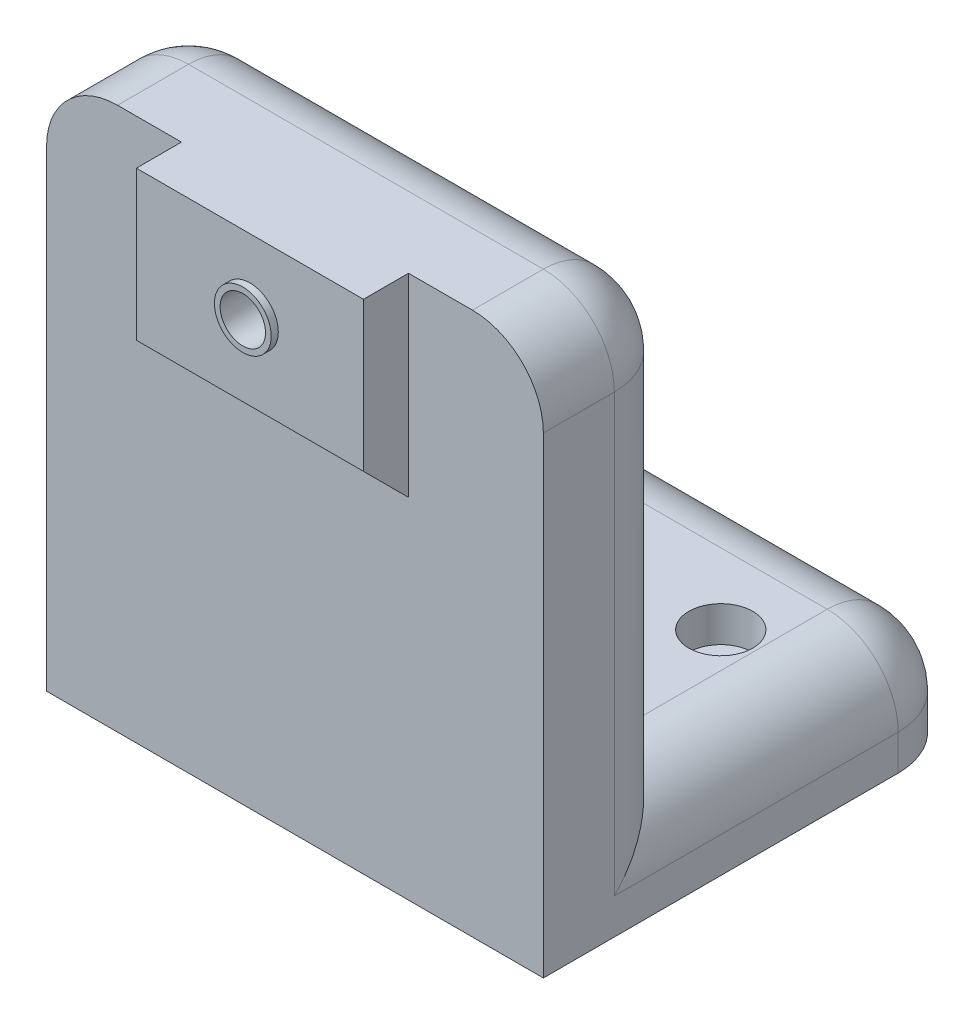
ISO-10303-21;
HEADER;
FILE_DESCRIPTION(('STEP AP214'),'2;1');
FILE_NAME('part.step','',(''),(''),'','','');
FILE_SCHEMA(('AUTOMOTIVE_DESIGN { 1 0 10303 214 1 1 1 1 }'));
ENDSEC;
DATA;
#1=APPLICATION_CONTEXT('core data for automotive mechanical design processes');
#2=APPLICATION_PROTOCOL_DEFINITION('international standard','automotive_design',2000,#1);
#3=PRODUCT_CONTEXT('',#1,'mechanical');
#4=PRODUCT('Part','Part','',(#3));
#5=PRODUCT_RELATED_PRODUCT_CATEGORY('part','',(#4));
#6=PRODUCT_DEFINITION_FORMATION('','',#4);
#7=PRODUCT_DEFINITION_CONTEXT('part definition',#1,'design');
#8=PRODUCT_DEFINITION('design','',#6,#7);
#9=PRODUCT_DEFINITION_SHAPE('','',#8);
#10=(LENGTH_UNIT() NAMED_UNIT(*) SI_UNIT(.MILLI.,.METRE.));
#11=(NAMED_UNIT(*) PLANE_ANGLE_UNIT() SI_UNIT($,.RADIAN.));
#12=(NAMED_UNIT(*) SI_UNIT($,.STERADIAN.) SOLID_ANGLE_UNIT());
#13=UNCERTAINTY_MEASURE_WITH_UNIT(LENGTH_MEASURE(1.E-05),#10,'distance_accuracy_value','');
#14=(GEOMETRIC_REPRESENTATION_CONTEXT(3) GLOBAL_UNCERTAINTY_ASSIGNED_CONTEXT((#13)) GLOBAL_UNIT_ASSIGNED_CONTEXT((#10,
#11,#12)) REPRESENTATION_CONTEXT('',''));
#15=CARTESIAN_POINT('',(0.,0.,0.));
#16=DIRECTION('',(0.,0.,1.));
#17=DIRECTION('',(1.,0.,0.));
#18=AXIS2_PLACEMENT_3D('',#15,#16,#17);
#19=CARTESIAN_POINT('',(0.,0.,6.35));
#20=DIRECTION('',(0.,0.,1.));
#21=DIRECTION('',(1.,0.,0.));
#22=AXIS2_PLACEMENT_3D('',#19,#20,#21);
#23=PLANE('',#22);
#24=DIRECTION('',(0.,1.,0.));
#25=VECTOR('',#24,1.);
#26=CARTESIAN_POINT('',(51.,76.5,6.35));
#27=LINE('',#26,#25);
#28=CARTESIAN_POINT('',(51.,55.4999999999999,6.35));
#29=VERTEX_POINT('',#28);
#30=CARTESIAN_POINT('',(51.,76.5,6.35));
#31=VERTEX_POINT('',#30);
#32=EDGE_CURVE('E73',#29,#31,#27,.T.);
#33=ORIENTED_EDGE('',*,*,#32,.T.);
#34=DIRECTION('',(-1.,0.,0.));
#35=VECTOR('',#34,1.);
#36=CARTESIAN_POINT('',(19.,76.5,6.35));
#37=LINE('',#36,#35);
#38=CARTESIAN_POINT('',(19.,76.5,6.35));
#39=VERTEX_POINT('',#38);
#40=EDGE_CURVE('E171',#31,#39,#37,.T.);
#41=ORIENTED_EDGE('',*,*,#40,.T.);
#42=DIRECTION('',(0.,-1.,0.));
#43=VECTOR('',#42,1.);
#44=CARTESIAN_POINT('',(19.,76.5,6.35));
#45=LINE('',#44,#43);
#46=CARTESIAN_POINT('',(19.,55.4999999999999,6.35));
#47=VERTEX_POINT('',#46);
#48=EDGE_CURVE('E66',#39,#47,#45,.T.);
#49=ORIENTED_EDGE('',*,*,#48,.T.);
#50=DIRECTION('',(-1.,0.,0.));
#51=VECTOR('',#50,1.);
#52=CARTESIAN_POINT('',(19.,55.4999999999999,6.35));
#53=LINE('',#52,#51);
#54=EDGE_CURVE('E182',#47,#29,#53,.F.);
#55=ORIENTED_EDGE('',*,*,#54,.T.);
#56=EDGE_LOOP('',(#33,#41,#49,#55));
#57=FACE_BOUND('',#56,.T.);
#58=CARTESIAN_POINT('',(35.,66.5,6.35));
#59=DIRECTION('',(0.,0.,1.));
#60=DIRECTION('',(1.,0.,0.));
#61=AXIS2_PLACEMENT_3D('',#58,#59,#60);
#62=CIRCLE('',#61,4.00000000000001);
#63=CARTESIAN_POINT('',(39.,66.5,6.35));
#64=VERTEX_POINT('',#63);
#65=EDGE_CURVE('E425',#64,#64,#62,.T.);
#66=ORIENTED_EDGE('',*,*,#65,.F.);
#67=EDGE_LOOP('',(#66));
#68=FACE_BOUND('',#67,.T.);
#69=ADVANCED_FACE('F49',(#57,#68),#23,.T.);
#70=CARTESIAN_POINT('',(0.,15.,0.));
#71=DIRECTION('',(0.,0.,-1.));
#72=DIRECTION('',(-1.,0.,0.));
#73=AXIS2_PLACEMENT_3D('',#70,#71,#72);
#74=PLANE('',#73);
#75=DIRECTION('',(0.,1.,0.));
#76=VECTOR('',#75,1.);
#77=CARTESIAN_POINT('',(51.,76.5,0.));
#78=LINE('',#77,#76);
#79=CARTESIAN_POINT('',(51.,49.1499999999999,0.));
#80=VERTEX_POINT('',#79);
#81=CARTESIAN_POINT('',(51.,76.5,0.));
#82=VERTEX_POINT('',#81);
#83=EDGE_CURVE('E188',#80,#82,#78,.T.);
#84=ORIENTED_EDGE('',*,*,#83,.F.);
#85=DIRECTION('',(-1.,0.,0.));
#86=VECTOR('',#85,1.);
#87=CARTESIAN_POINT('',(19.,49.1499999999999,0.));
#88=LINE('',#87,#86);
#89=CARTESIAN_POINT('',(19.,49.1499999999999,0.));
#90=VERTEX_POINT('',#89);
#91=EDGE_CURVE('E357',#80,#90,#88,.T.);
#92=ORIENTED_EDGE('',*,*,#91,.T.);
#93=DIRECTION('',(0.,-1.,0.));
#94=VECTOR('',#93,1.);
#95=CARTESIAN_POINT('',(19.,76.5,0.));
#96=LINE('',#95,#94);
#97=CARTESIAN_POINT('',(19.,76.5,0.));
#98=VERTEX_POINT('',#97);
#99=EDGE_CURVE('E185',#98,#90,#96,.T.);
#100=ORIENTED_EDGE('',*,*,#99,.F.);
#101=DIRECTION('',(1.,0.,0.));
#102=VECTOR('',#101,1.);
#103=CARTESIAN_POINT('',(0.,76.5,0.));
#104=LINE('',#103,#102);
#105=CARTESIAN_POINT('',(10.,76.5,0.));
#106=VERTEX_POINT('',#105);
#107=EDGE_CURVE('E244',#106,#98,#104,.T.);
#108=ORIENTED_EDGE('',*,*,#107,.F.);
#109=CARTESIAN_POINT('',(10.,66.5,0.));
#110=DIRECTION('',(0.,0.,-1.));
#111=DIRECTION('',(-1.,0.,0.));
#112=AXIS2_PLACEMENT_3D('',#109,#110,#111);
#113=CIRCLE('',#112,10.);
#114=CARTESIAN_POINT('',(0.,66.5,0.));
#115=VERTEX_POINT('',#114);
#116=EDGE_CURVE('E355',#106,#115,#113,.F.);
#117=ORIENTED_EDGE('',*,*,#116,.T.);
#118=DIRECTION('',(0.,-1.,0.));
#119=VECTOR('',#118,1.);
#120=CARTESIAN_POINT('',(0.,15.,0.));
#121=LINE('',#120,#119);
#122=CARTESIAN_POINT('',(0.,0.,0.));
#123=VERTEX_POINT('',#122);
#124=EDGE_CURVE('E270',#115,#123,#121,.T.);
#125=ORIENTED_EDGE('',*,*,#124,.T.);
#126=DIRECTION('',(1.,0.,0.));
#127=VECTOR('',#126,1.);
#128=CARTESIAN_POINT('',(0.,0.,0.));
#129=LINE('',#128,#127);
#130=CARTESIAN_POINT('',(70.,0.,0.));
#131=VERTEX_POINT('',#130);
#132=EDGE_CURVE('E255',#123,#131,#129,.T.);
#133=ORIENTED_EDGE('',*,*,#132,.T.);
#134=DIRECTION('',(0.,-1.,0.));
#135=VECTOR('',#134,1.);
#136=CARTESIAN_POINT('',(70.,15.,0.));
#137=LINE('',#136,#135);
#138=CARTESIAN_POINT('',(70.,66.5,0.));
#139=VERTEX_POINT('',#138);
#140=EDGE_CURVE('E267',#139,#131,#137,.T.);
#141=ORIENTED_EDGE('',*,*,#140,.F.);
#142=CARTESIAN_POINT('',(60.,66.5,0.));
#143=DIRECTION('',(0.,0.,-1.));
#144=DIRECTION('',(-1.,0.,0.));
#145=AXIS2_PLACEMENT_3D('',#142,#143,#144);
#146=CIRCLE('',#145,10.);
#147=CARTESIAN_POINT('',(60.,76.5,0.));
#148=VERTEX_POINT('',#147);
#149=EDGE_CURVE('E351',#139,#148,#146,.F.);
#150=ORIENTED_EDGE('',*,*,#149,.T.);
#151=EDGE_CURVE('E248',#82,#148,#104,.T.);
#152=ORIENTED_EDGE('',*,*,#151,.F.);
#153=EDGE_LOOP('',(#84,#92,#100,#108,#117,#125,#133,#141,#150,#152));
#154=FACE_BOUND('',#153,.T.);
#155=ADVANCED_FACE('F417',(#154),#74,.F.);
#156=CARTESIAN_POINT('',(55.,0.,-40.));
#157=DIRECTION('',(0.,1.,0.));
#158=DIRECTION('',(0.,0.,1.));
#159=AXIS2_PLACEMENT_3D('',#156,#157,#158);
#160=CYLINDRICAL_SURFACE('',#159,1.9);
#161=CARTESIAN_POINT('',(55.,0.,-40.));
#162=DIRECTION('',(0.,1.,0.));
#163=DIRECTION('',(0.,0.,1.));
#164=AXIS2_PLACEMENT_3D('',#161,#162,#163);
#165=CIRCLE('',#164,1.9);
#166=CARTESIAN_POINT('',(55.,0.,-38.1));
#167=VERTEX_POINT('',#166);
#168=EDGE_CURVE('E235',#167,#167,#165,.T.);
#169=ORIENTED_EDGE('',*,*,#168,.F.);
#170=EDGE_LOOP('',(#169));
#171=FACE_BOUND('',#170,.T.);
#172=CARTESIAN_POINT('',(55.,10.,-40.));
#173=DIRECTION('',(0.,1.,0.));
#174=DIRECTION('',(0.,0.,1.));
#175=AXIS2_PLACEMENT_3D('',#172,#173,#174);
#176=CIRCLE('',#175,1.9);
#177=CARTESIAN_POINT('',(55.,10.,-38.1));
#178=VERTEX_POINT('',#177);
#179=EDGE_CURVE('E239',#178,#178,#176,.F.);
#180=ORIENTED_EDGE('',*,*,#179,.F.);
#181=EDGE_LOOP('',(#180));
#182=FACE_BOUND('',#181,.T.);
#183=ADVANCED_FACE('F458',(#171,#182),#160,.F.);
#184=CARTESIAN_POINT('',(35.,0.,-40.));
#185=DIRECTION('',(0.,1.,0.));
#186=DIRECTION('',(0.,0.,1.));
#187=AXIS2_PLACEMENT_3D('',#184,#185,#186);
#188=CYLINDRICAL_SURFACE('',#187,1.9);
#189=CARTESIAN_POINT('',(35.,0.,-40.));
#190=DIRECTION('',(0.,1.,0.));
#191=DIRECTION('',(0.,0.,1.));
#192=AXIS2_PLACEMENT_3D('',#189,#190,#191);
#193=CIRCLE('',#192,1.9);
#194=CARTESIAN_POINT('',(35.,0.,-38.1));
#195=VERTEX_POINT('',#194);
#196=EDGE_CURVE('E231',#195,#195,#193,.T.);
#197=ORIENTED_EDGE('',*,*,#196,.F.);
#198=EDGE_LOOP('',(#197));
#199=FACE_BOUND('',#198,.T.);
#200=CARTESIAN_POINT('',(35.,10.,-40.));
#201=DIRECTION('',(0.,1.,0.));
#202=DIRECTION('',(0.,0.,1.));
#203=AXIS2_PLACEMENT_3D('',#200,#201,#202);
#204=CIRCLE('',#203,1.9);
#205=CARTESIAN_POINT('',(35.,10.,-38.1));
#206=VERTEX_POINT('',#205);
#207=EDGE_CURVE('E277',#206,#206,#204,.F.);
#208=ORIENTED_EDGE('',*,*,#207,.F.);
#209=EDGE_LOOP('',(#208));
#210=FACE_BOUND('',#209,.T.);
#211=ADVANCED_FACE('F496',(#199,#210),#188,.F.);
#212=CARTESIAN_POINT('',(15.,0.,-40.));
#213=DIRECTION('',(0.,1.,0.));
#214=DIRECTION('',(0.,0.,1.));
#215=AXIS2_PLACEMENT_3D('',#212,#213,#214);
#216=CYLINDRICAL_SURFACE('',#215,1.9);
#217=CARTESIAN_POINT('',(15.,0.,-40.));
#218=DIRECTION('',(0.,1.,0.));
#219=DIRECTION('',(0.,0.,1.));
#220=AXIS2_PLACEMENT_3D('',#217,#218,#219);
#221=CIRCLE('',#220,1.9);
#222=CARTESIAN_POINT('',(15.,0.,-38.1));
#223=VERTEX_POINT('',#222);
#224=EDGE_CURVE('E226',#223,#223,#221,.T.);
#225=ORIENTED_EDGE('',*,*,#224,.F.);
#226=EDGE_LOOP('',(#225));
#227=FACE_BOUND('',#226,.T.);
#228=CARTESIAN_POINT('',(15.,10.,-40.));
#229=DIRECTION('',(0.,1.,0.));
#230=DIRECTION('',(0.,0.,1.));
#231=AXIS2_PLACEMENT_3D('',#228,#229,#230);
#232=CIRCLE('',#231,1.9);
#233=CARTESIAN_POINT('',(15.,10.,-38.1));
#234=VERTEX_POINT('',#233);
#235=EDGE_CURVE('E204',#234,#234,#232,.F.);
#236=ORIENTED_EDGE('',*,*,#235,.F.);
#237=EDGE_LOOP('',(#236));
#238=FACE_BOUND('',#237,.T.);
#239=ADVANCED_FACE('F492',(#227,#238),#216,.F.);
#240=CARTESIAN_POINT('',(0.,15.,0.));
#241=DIRECTION('',(0.,-1.,0.));
#242=DIRECTION('',(0.,0.,-1.));
#243=AXIS2_PLACEMENT_3D('',#240,#241,#242);
#244=PLANE('',#243);
#245=CARTESIAN_POINT('',(15.,15.,-40.));
#246=DIRECTION('',(0.,1.,0.));
#247=DIRECTION('',(0.,0.,1.));
#248=AXIS2_PLACEMENT_3D('',#245,#246,#247);
#249=CIRCLE('',#248,4.5);
#250=CARTESIAN_POINT('',(15.,15.,-35.5));
#251=VERTEX_POINT('',#250);
#252=EDGE_CURVE('E205',#251,#251,#249,.T.);
#253=ORIENTED_EDGE('',*,*,#252,.F.);
#254=EDGE_LOOP('',(#253));
#255=FACE_BOUND('',#254,.T.);
#256=CARTESIAN_POINT('',(35.,15.,-40.));
#257=DIRECTION('',(0.,1.,0.));
#258=DIRECTION('',(0.,0.,1.));
#259=AXIS2_PLACEMENT_3D('',#256,#257,#258);
#260=CIRCLE('',#259,4.5);
#261=CARTESIAN_POINT('',(35.,15.,-35.5));
#262=VERTEX_POINT('',#261);
#263=EDGE_CURVE('E209',#262,#262,#260,.T.);
#264=ORIENTED_EDGE('',*,*,#263,.F.);
#265=EDGE_LOOP('',(#264));
#266=FACE_BOUND('',#265,.T.);
#267=CARTESIAN_POINT('',(55.,15.,-40.));
#268=DIRECTION('',(0.,1.,0.));
#269=DIRECTION('',(0.,0.,1.));
#270=AXIS2_PLACEMENT_3D('',#267,#268,#269);
#271=CIRCLE('',#270,4.5);
#272=CARTESIAN_POINT('',(55.,15.,-35.5));
#273=VERTEX_POINT('',#272);
#274=EDGE_CURVE('E217',#273,#273,#271,.T.);
#275=ORIENTED_EDGE('',*,*,#274,.F.);
#276=EDGE_LOOP('',(#275));
#277=FACE_BOUND('',#276,.T.);
#278=DIRECTION('',(-1.,0.,0.));
#279=VECTOR('',#278,1.);
#280=CARTESIAN_POINT('',(0.,15.,-20.));
#281=LINE('',#280,#279);
#282=CARTESIAN_POINT('',(60.,15.,-20.));
#283=VERTEX_POINT('',#282);
#284=CARTESIAN_POINT('',(10.,15.,-20.));
#285=VERTEX_POINT('',#284);
#286=EDGE_CURVE('E243',#283,#285,#281,.T.);
#287=ORIENTED_EDGE('',*,*,#286,.F.);
#288=DIRECTION('',(0.,0.,-1.));
#289=VECTOR('',#288,1.);
#290=CARTESIAN_POINT('',(60.,15.,0.));
#291=LINE('',#290,#289);
#292=CARTESIAN_POINT('',(60.,15.,-50.));
#293=VERTEX_POINT('',#292);
#294=EDGE_CURVE('E330',#283,#293,#291,.T.);
#295=ORIENTED_EDGE('',*,*,#294,.T.);
#296=DIRECTION('',(-1.,0.,0.));
#297=VECTOR('',#296,1.);
#298=CARTESIAN_POINT('',(0.,15.,-50.));
#299=LINE('',#298,#297);
#300=CARTESIAN_POINT('',(10.,15.,-50.));
#301=VERTEX_POINT('',#300);
#302=EDGE_CURVE('E326',#293,#301,#299,.T.);
#303=ORIENTED_EDGE('',*,*,#302,.T.);
#304=DIRECTION('',(0.,0.,1.));
#305=VECTOR('',#304,1.);
#306=CARTESIAN_POINT('',(10.,15.,0.));
#307=LINE('',#306,#305);
#308=EDGE_CURVE('E323',#301,#285,#307,.T.);
#309=ORIENTED_EDGE('',*,*,#308,.T.);
#310=EDGE_LOOP('',(#287,#295,#303,#309));
#311=FACE_BOUND('',#310,.T.);
#312=ADVANCED_FACE('F495',(#255,#266,#277,#311),#244,.F.);
#313=CARTESIAN_POINT('',(0.,15.,0.));
#314=DIRECTION('',(1.,0.,0.));
#315=DIRECTION('',(0.,0.,-1.));
#316=AXIS2_PLACEMENT_3D('',#313,#314,#315);
#317=PLANE('',#316);
#318=DIRECTION('',(0.,0.,1.));
#319=VECTOR('',#318,1.);
#320=CARTESIAN_POINT('',(0.,5.,0.));
#321=LINE('',#320,#319);
#322=CARTESIAN_POINT('',(0.,5.,-10.));
#323=VERTEX_POINT('',#322);
#324=CARTESIAN_POINT('',(0.,5.,-50.));
#325=VERTEX_POINT('',#324);
#326=EDGE_CURVE('E289',#323,#325,#321,.F.);
#327=ORIENTED_EDGE('',*,*,#326,.T.);
#328=DIRECTION('',(0.,-1.,0.));
#329=VECTOR('',#328,1.);
#330=CARTESIAN_POINT('',(0.,15.,-50.));
#331=LINE('',#330,#329);
#332=CARTESIAN_POINT('',(0.,0.,-50.));
#333=VERTEX_POINT('',#332);
#334=EDGE_CURVE('E292',#325,#333,#331,.T.);
#335=ORIENTED_EDGE('',*,*,#334,.T.);
#336=DIRECTION('',(0.,0.,1.));
#337=VECTOR('',#336,1.);
#338=CARTESIAN_POINT('',(0.,0.,0.));
#339=LINE('',#338,#337);
#340=EDGE_CURVE('E247',#333,#123,#339,.T.);
#341=ORIENTED_EDGE('',*,*,#340,.T.);
#342=ORIENTED_EDGE('',*,*,#124,.F.);
#343=DIRECTION('',(0.,0.,1.));
#344=VECTOR('',#343,1.);
#345=CARTESIAN_POINT('',(0.,66.5,0.));
#346=LINE('',#345,#344);
#347=CARTESIAN_POINT('',(0.,66.5,-10.));
#348=VERTEX_POINT('',#347);
#349=EDGE_CURVE('E273',#115,#348,#346,.F.);
#350=ORIENTED_EDGE('',*,*,#349,.T.);
#351=DIRECTION('',(0.,-1.,0.));
#352=VECTOR('',#351,1.);
#353=CARTESIAN_POINT('',(0.,15.,-10.));
#354=LINE('',#353,#352);
#355=EDGE_CURVE('E286',#348,#323,#354,.T.);
#356=ORIENTED_EDGE('',*,*,#355,.T.);
#357=EDGE_LOOP('',(#327,#335,#341,#342,#350,#356));
#358=FACE_BOUND('',#357,.T.);
#359=ADVANCED_FACE('F519',(#358),#317,.F.);
#360=CARTESIAN_POINT('',(70.,15.,0.));
#361=DIRECTION('',(-1.,0.,0.));
#362=DIRECTION('',(0.,0.,1.));
#363=AXIS2_PLACEMENT_3D('',#360,#361,#362);
#364=PLANE('',#363);
#365=DIRECTION('',(0.,0.,-1.));
#366=VECTOR('',#365,1.);
#367=CARTESIAN_POINT('',(70.,0.,0.));
#368=LINE('',#367,#366);
#369=CARTESIAN_POINT('',(70.,0.,-50.));
#370=VERTEX_POINT('',#369);
#371=EDGE_CURVE('E259',#131,#370,#368,.T.);
#372=ORIENTED_EDGE('',*,*,#371,.T.);
#373=DIRECTION('',(0.,-1.,0.));
#374=VECTOR('',#373,1.);
#375=CARTESIAN_POINT('',(70.,15.,-50.));
#376=LINE('',#375,#374);
#377=CARTESIAN_POINT('',(70.,5.,-50.));
#378=VERTEX_POINT('',#377);
#379=EDGE_CURVE('E320',#370,#378,#376,.F.);
#380=ORIENTED_EDGE('',*,*,#379,.T.);
#381=DIRECTION('',(0.,0.,-1.));
#382=VECTOR('',#381,1.);
#383=CARTESIAN_POINT('',(70.,5.,0.));
#384=LINE('',#383,#382);
#385=CARTESIAN_POINT('',(70.,5.,-10.));
#386=VERTEX_POINT('',#385);
#387=EDGE_CURVE('E317',#378,#386,#384,.F.);
#388=ORIENTED_EDGE('',*,*,#387,.T.);
#389=DIRECTION('',(0.,-1.,0.));
#390=VECTOR('',#389,1.);
#391=CARTESIAN_POINT('',(70.,15.,-10.));
#392=LINE('',#391,#390);
#393=CARTESIAN_POINT('',(70.,66.5,-10.));
#394=VERTEX_POINT('',#393);
#395=EDGE_CURVE('E314',#386,#394,#392,.F.);
#396=ORIENTED_EDGE('',*,*,#395,.T.);
#397=DIRECTION('',(0.,0.,-1.));
#398=VECTOR('',#397,1.);
#399=CARTESIAN_POINT('',(70.,66.5,0.));
#400=LINE('',#399,#398);
#401=EDGE_CURVE('E311',#394,#139,#400,.F.);
#402=ORIENTED_EDGE('',*,*,#401,.T.);
#403=ORIENTED_EDGE('',*,*,#140,.T.);
#404=EDGE_LOOP('',(#372,#380,#388,#396,#402,#403));
#405=FACE_BOUND('',#404,.T.);
#406=ADVANCED_FACE('F527',(#405),#364,.F.);
#407=CARTESIAN_POINT('',(0.,15.,-60.));
#408=DIRECTION('',(0.,0.,1.));
#409=DIRECTION('',(1.,0.,0.));
#410=AXIS2_PLACEMENT_3D('',#407,#408,#409);
#411=PLANE('',#410);
#412=DIRECTION('',(-1.,0.,0.));
#413=VECTOR('',#412,1.);
#414=CARTESIAN_POINT('',(0.,0.,-60.));
#415=LINE('',#414,#413);
#416=CARTESIAN_POINT('',(60.,0.,-60.));
#417=VERTEX_POINT('',#416);
#418=CARTESIAN_POINT('',(10.,0.,-60.));
#419=VERTEX_POINT('',#418);
#420=EDGE_CURVE('E263',#417,#419,#415,.T.);
#421=ORIENTED_EDGE('',*,*,#420,.T.);
#422=DIRECTION('',(0.,-1.,0.));
#423=VECTOR('',#422,1.);
#424=CARTESIAN_POINT('',(10.,15.,-60.));
#425=LINE('',#424,#423);
#426=CARTESIAN_POINT('',(10.,5.,-60.));
#427=VERTEX_POINT('',#426);
#428=EDGE_CURVE('E308',#419,#427,#425,.F.);
#429=ORIENTED_EDGE('',*,*,#428,.T.);
#430=DIRECTION('',(-1.,0.,0.));
#431=VECTOR('',#430,1.);
#432=CARTESIAN_POINT('',(0.,5.,-60.));
#433=LINE('',#432,#431);
#434=CARTESIAN_POINT('',(60.,5.,-60.));
#435=VERTEX_POINT('',#434);
#436=EDGE_CURVE('E302',#427,#435,#433,.F.);
#437=ORIENTED_EDGE('',*,*,#436,.T.);
#438=DIRECTION('',(0.,-1.,0.));
#439=VECTOR('',#438,1.);
#440=CARTESIAN_POINT('',(60.,15.,-60.));
#441=LINE('',#440,#439);
#442=EDGE_CURVE('E305',#435,#417,#441,.T.);
#443=ORIENTED_EDGE('',*,*,#442,.T.);
#444=EDGE_LOOP('',(#421,#429,#437,#443));
#445=FACE_BOUND('',#444,.T.);
#446=ADVANCED_FACE('F523',(#445),#411,.F.);
#447=CARTESIAN_POINT('',(0.,0.,0.));
#448=DIRECTION('',(0.,-1.,0.));
#449=DIRECTION('',(0.,0.,-1.));
#450=AXIS2_PLACEMENT_3D('',#447,#448,#449);
#451=PLANE('',#450);
#452=ORIENTED_EDGE('',*,*,#224,.T.);
#453=EDGE_LOOP('',(#452));
#454=FACE_BOUND('',#453,.T.);
#455=ORIENTED_EDGE('',*,*,#196,.T.);
#456=EDGE_LOOP('',(#455));
#457=FACE_BOUND('',#456,.T.);
#458=ORIENTED_EDGE('',*,*,#168,.T.);
#459=EDGE_LOOP('',(#458));
#460=FACE_BOUND('',#459,.T.);
#461=ORIENTED_EDGE('',*,*,#340,.F.);
#462=CARTESIAN_POINT('',(10.,0.,-50.));
#463=DIRECTION('',(0.,-1.,0.));
#464=DIRECTION('',(0.,0.,-1.));
#465=AXIS2_PLACEMENT_3D('',#462,#463,#464);
#466=CIRCLE('',#465,10.);
#467=EDGE_CURVE('E299',#333,#419,#466,.T.);
#468=ORIENTED_EDGE('',*,*,#467,.T.);
#469=ORIENTED_EDGE('',*,*,#420,.F.);
#470=CARTESIAN_POINT('',(60.,0.,-50.));
#471=DIRECTION('',(0.,-1.,0.));
#472=DIRECTION('',(0.,0.,-1.));
#473=AXIS2_PLACEMENT_3D('',#470,#471,#472);
#474=CIRCLE('',#473,10.);
#475=EDGE_CURVE('E296',#417,#370,#474,.T.);
#476=ORIENTED_EDGE('',*,*,#475,.T.);
#477=ORIENTED_EDGE('',*,*,#371,.F.);
#478=ORIENTED_EDGE('',*,*,#132,.F.);
#479=EDGE_LOOP('',(#461,#468,#469,#476,#477,#478));
#480=FACE_BOUND('',#479,.T.);
#481=ADVANCED_FACE('F515',(#454,#457,#460,#480),#451,.T.);
#482=CARTESIAN_POINT('',(0.,76.5,-20.));
#483=DIRECTION('',(0.,0.,1.));
#484=DIRECTION('',(1.,0.,0.));
#485=AXIS2_PLACEMENT_3D('',#482,#483,#484);
#486=PLANE('',#485);
#487=DIRECTION('',(-1.,0.,0.));
#488=VECTOR('',#487,1.);
#489=CARTESIAN_POINT('',(0.,66.5,-20.));
#490=LINE('',#489,#488);
#491=CARTESIAN_POINT('',(10.,66.5,-20.));
#492=VERTEX_POINT('',#491);
#493=CARTESIAN_POINT('',(60.,66.5,-20.));
#494=VERTEX_POINT('',#493);
#495=EDGE_CURVE('E333',#492,#494,#490,.F.);
#496=ORIENTED_EDGE('',*,*,#495,.T.);
#497=DIRECTION('',(0.,-1.,0.));
#498=VECTOR('',#497,1.);
#499=CARTESIAN_POINT('',(60.,76.5,-20.));
#500=LINE('',#499,#498);
#501=EDGE_CURVE('E339',#494,#283,#500,.T.);
#502=ORIENTED_EDGE('',*,*,#501,.T.);
#503=ORIENTED_EDGE('',*,*,#286,.T.);
#504=DIRECTION('',(0.,-1.,0.));
#505=VECTOR('',#504,1.);
#506=CARTESIAN_POINT('',(10.,76.5,-20.));
#507=LINE('',#506,#505);
#508=EDGE_CURVE('E336',#285,#492,#507,.F.);
#509=ORIENTED_EDGE('',*,*,#508,.T.);
#510=EDGE_LOOP('',(#496,#502,#503,#509));
#511=FACE_BOUND('',#510,.T.);
#512=ADVANCED_FACE('F512',(#511),#486,.F.);
#513=CARTESIAN_POINT('',(0.,76.5,0.));
#514=DIRECTION('',(0.,-1.,0.));
#515=DIRECTION('',(0.,0.,-1.));
#516=AXIS2_PLACEMENT_3D('',#513,#514,#515);
#517=PLANE('',#516);
#518=DIRECTION('',(-1.,0.,0.));
#519=VECTOR('',#518,1.);
#520=CARTESIAN_POINT('',(0.,76.5,-10.));
#521=LINE('',#520,#519);
#522=CARTESIAN_POINT('',(60.,76.5,-10.));
#523=VERTEX_POINT('',#522);
#524=CARTESIAN_POINT('',(10.,76.5,-10.));
#525=VERTEX_POINT('',#524);
#526=EDGE_CURVE('E342',#523,#525,#521,.T.);
#527=ORIENTED_EDGE('',*,*,#526,.T.);
#528=DIRECTION('',(0.,0.,1.));
#529=VECTOR('',#528,1.);
#530=CARTESIAN_POINT('',(10.,76.5,0.));
#531=LINE('',#530,#529);
#532=EDGE_CURVE('E348',#525,#106,#531,.T.);
#533=ORIENTED_EDGE('',*,*,#532,.T.);
#534=ORIENTED_EDGE('',*,*,#107,.T.);
#535=DIRECTION('',(0.,0.,-1.));
#536=VECTOR('',#535,1.);
#537=CARTESIAN_POINT('',(19.,76.5,6.35));
#538=LINE('',#537,#536);
#539=EDGE_CURVE('E177',#39,#98,#538,.T.);
#540=ORIENTED_EDGE('',*,*,#539,.F.);
#541=ORIENTED_EDGE('',*,*,#40,.F.);
#542=DIRECTION('',(0.,0.,-1.));
#543=VECTOR('',#542,1.);
#544=CARTESIAN_POINT('',(51.,76.5,6.35));
#545=LINE('',#544,#543);
#546=EDGE_CURVE('E173',#31,#82,#545,.T.);
#547=ORIENTED_EDGE('',*,*,#546,.T.);
#548=ORIENTED_EDGE('',*,*,#151,.T.);
#549=DIRECTION('',(0.,0.,-1.));
#550=VECTOR('',#549,1.);
#551=CARTESIAN_POINT('',(60.,76.5,0.));
#552=LINE('',#551,#550);
#553=EDGE_CURVE('E345',#148,#523,#552,.T.);
#554=ORIENTED_EDGE('',*,*,#553,.T.);
#555=EDGE_LOOP('',(#527,#533,#534,#540,#541,#547,#548,#554));
#556=FACE_BOUND('',#555,.T.);
#557=ADVANCED_FACE('F172',(#556),#517,.F.);
#558=CARTESIAN_POINT('',(15.,10.,-40.));
#559=DIRECTION('',(0.,1.,0.));
#560=DIRECTION('',(0.,0.,1.));
#561=AXIS2_PLACEMENT_3D('',#558,#559,#560);
#562=PLANE('',#561);
#563=CARTESIAN_POINT('',(15.,10.,-40.));
#564=DIRECTION('',(0.,1.,0.));
#565=DIRECTION('',(0.,0.,1.));
#566=AXIS2_PLACEMENT_3D('',#563,#564,#565);
#567=CIRCLE('',#566,4.5);
#568=CARTESIAN_POINT('',(15.,10.,-35.5));
#569=VERTEX_POINT('',#568);
#570=EDGE_CURVE('E200',#569,#569,#567,.T.);
#571=ORIENTED_EDGE('',*,*,#570,.T.);
#572=EDGE_LOOP('',(#571));
#573=FACE_BOUND('',#572,.T.);
#574=ORIENTED_EDGE('',*,*,#235,.T.);
#575=EDGE_LOOP('',(#574));
#576=FACE_BOUND('',#575,.T.);
#577=ADVANCED_FACE('F467',(#573,#576),#562,.T.);
#578=CARTESIAN_POINT('',(15.,10.,-40.));
#579=DIRECTION('',(0.,1.,0.));
#580=DIRECTION('',(0.,0.,1.));
#581=AXIS2_PLACEMENT_3D('',#578,#579,#580);
#582=CYLINDRICAL_SURFACE('',#581,4.5);
#583=ORIENTED_EDGE('',*,*,#570,.F.);
#584=EDGE_LOOP('',(#583));
#585=FACE_BOUND('',#584,.T.);
#586=ORIENTED_EDGE('',*,*,#252,.T.);
#587=EDGE_LOOP('',(#586));
#588=FACE_BOUND('',#587,.T.);
#589=ADVANCED_FACE('F470',(#585,#588),#582,.F.);
#590=CARTESIAN_POINT('',(35.,10.,-40.));
#591=DIRECTION('',(0.,1.,0.));
#592=DIRECTION('',(0.,0.,1.));
#593=AXIS2_PLACEMENT_3D('',#590,#591,#592);
#594=PLANE('',#593);
#595=CARTESIAN_POINT('',(35.,10.,-40.));
#596=DIRECTION('',(0.,1.,0.));
#597=DIRECTION('',(0.,0.,1.));
#598=AXIS2_PLACEMENT_3D('',#595,#596,#597);
#599=CIRCLE('',#598,4.5);
#600=CARTESIAN_POINT('',(35.,10.,-35.5));
#601=VERTEX_POINT('',#600);
#602=EDGE_CURVE('E213',#601,#601,#599,.T.);
#603=ORIENTED_EDGE('',*,*,#602,.T.);
#604=EDGE_LOOP('',(#603));
#605=FACE_BOUND('',#604,.T.);
#606=ORIENTED_EDGE('',*,*,#207,.T.);
#607=EDGE_LOOP('',(#606));
#608=FACE_BOUND('',#607,.T.);
#609=ADVANCED_FACE('F474',(#605,#608),#594,.T.);
#610=CARTESIAN_POINT('',(35.,10.,-40.));
#611=DIRECTION('',(0.,1.,0.));
#612=DIRECTION('',(0.,0.,1.));
#613=AXIS2_PLACEMENT_3D('',#610,#611,#612);
#614=CYLINDRICAL_SURFACE('',#613,4.5);
#615=ORIENTED_EDGE('',*,*,#602,.F.);
#616=EDGE_LOOP('',(#615));
#617=FACE_BOUND('',#616,.T.);
#618=ORIENTED_EDGE('',*,*,#263,.T.);
#619=EDGE_LOOP('',(#618));
#620=FACE_BOUND('',#619,.T.);
#621=ADVANCED_FACE('F476',(#617,#620),#614,.F.);
#622=CARTESIAN_POINT('',(55.,10.,-40.));
#623=DIRECTION('',(0.,1.,0.));
#624=DIRECTION('',(0.,0.,1.));
#625=AXIS2_PLACEMENT_3D('',#622,#623,#624);
#626=PLANE('',#625);
#627=CARTESIAN_POINT('',(55.,10.,-40.));
#628=DIRECTION('',(0.,1.,0.));
#629=DIRECTION('',(0.,0.,1.));
#630=AXIS2_PLACEMENT_3D('',#627,#628,#629);
#631=CIRCLE('',#630,4.5);
#632=CARTESIAN_POINT('',(55.,10.,-35.5));
#633=VERTEX_POINT('',#632);
#634=EDGE_CURVE('E221',#633,#633,#631,.T.);
#635=ORIENTED_EDGE('',*,*,#634,.T.);
#636=EDGE_LOOP('',(#635));
#637=FACE_BOUND('',#636,.T.);
#638=ORIENTED_EDGE('',*,*,#179,.T.);
#639=EDGE_LOOP('',(#638));
#640=FACE_BOUND('',#639,.T.);
#641=ADVANCED_FACE('F479',(#637,#640),#626,.T.);
#642=CARTESIAN_POINT('',(55.,10.,-40.));
#643=DIRECTION('',(0.,1.,0.));
#644=DIRECTION('',(0.,0.,1.));
#645=AXIS2_PLACEMENT_3D('',#642,#643,#644);
#646=CYLINDRICAL_SURFACE('',#645,4.5);
#647=ORIENTED_EDGE('',*,*,#634,.F.);
#648=EDGE_LOOP('',(#647));
#649=FACE_BOUND('',#648,.T.);
#650=ORIENTED_EDGE('',*,*,#274,.T.);
#651=EDGE_LOOP('',(#650));
#652=FACE_BOUND('',#651,.T.);
#653=ADVANCED_FACE('F484',(#649,#652),#646,.F.);
#654=CARTESIAN_POINT('',(60.,66.5,0.));
#655=DIRECTION('',(0.,0.,-1.));
#656=DIRECTION('',(-1.,0.,0.));
#657=AXIS2_PLACEMENT_3D('',#654,#655,#656);
#658=CYLINDRICAL_SURFACE('',#657,10.);
#659=CARTESIAN_POINT('',(60.,66.5,-10.));
#660=DIRECTION('',(0.,0.,-1.));
#661=DIRECTION('',(-1.,0.,0.));
#662=AXIS2_PLACEMENT_3D('',#659,#660,#661);
#663=CIRCLE('',#662,10.);
#664=EDGE_CURVE('E225',#523,#394,#663,.T.);
#665=ORIENTED_EDGE('',*,*,#664,.F.);
#666=ORIENTED_EDGE('',*,*,#553,.F.);
#667=ORIENTED_EDGE('',*,*,#149,.F.);
#668=ORIENTED_EDGE('',*,*,#401,.F.);
#669=EDGE_LOOP('',(#665,#666,#667,#668));
#670=FACE_BOUND('',#669,.T.);
#671=ADVANCED_FACE('F487',(#670),#658,.T.);
#672=CARTESIAN_POINT('',(60.,66.5,-10.));
#673=DIRECTION('',(1.,0.,0.));
#674=DIRECTION('',(0.,0.,-1.));
#675=AXIS2_PLACEMENT_3D('',#672,#673,#674);
#676=SPHERICAL_SURFACE('',#675,10.);
#677=CARTESIAN_POINT('',(60.,66.5,-10.));
#678=DIRECTION('',(1.,0.,0.));
#679=DIRECTION('',(0.,0.,-1.));
#680=AXIS2_PLACEMENT_3D('',#677,#678,#679);
#681=CIRCLE('',#680,10.);
#682=EDGE_CURVE('E397',#523,#494,#681,.F.);
#683=ORIENTED_EDGE('',*,*,#682,.F.);
#684=ORIENTED_EDGE('',*,*,#664,.T.);
#685=CARTESIAN_POINT('',(60.,66.5,-10.));
#686=DIRECTION('',(0.,1.,0.));
#687=DIRECTION('',(0.,0.,1.));
#688=AXIS2_PLACEMENT_3D('',#685,#686,#687);
#689=CIRCLE('',#688,10.);
#690=EDGE_CURVE('E401',#494,#394,#689,.F.);
#691=ORIENTED_EDGE('',*,*,#690,.F.);
#692=EDGE_LOOP('',(#683,#684,#691));
#693=FACE_BOUND('',#692,.T.);
#694=ADVANCED_FACE('F581',(#693),#676,.T.);
#695=CARTESIAN_POINT('',(60.,76.5,-10.));
#696=DIRECTION('',(0.,-1.,0.));
#697=DIRECTION('',(0.,0.,-1.));
#698=AXIS2_PLACEMENT_3D('',#695,#696,#697);
#699=CYLINDRICAL_SURFACE('',#698,10.);
#700=ORIENTED_EDGE('',*,*,#690,.T.);
#701=ORIENTED_EDGE('',*,*,#395,.F.);
#702=CARTESIAN_POINT('',(60.,5.,-10.));
#703=DIRECTION('',(0.,-0.707106781186547,-0.707106781186547));
#704=DIRECTION('',(0.,-0.707106781186547,0.707106781186547));
#705=AXIS2_PLACEMENT_3D('',#702,#703,#704);
#706=ELLIPSE('',#705,14.1421356237309,10.);
#707=EDGE_CURVE('E393',#283,#386,#706,.T.);
#708=ORIENTED_EDGE('',*,*,#707,.F.);
#709=ORIENTED_EDGE('',*,*,#501,.F.);
#710=EDGE_LOOP('',(#700,#701,#708,#709));
#711=FACE_BOUND('',#710,.T.);
#712=ADVANCED_FACE('F577',(#711),#699,.T.);
#713=CARTESIAN_POINT('',(0.,66.5,-10.));
#714=DIRECTION('',(-1.,0.,0.));
#715=DIRECTION('',(0.,0.,1.));
#716=AXIS2_PLACEMENT_3D('',#713,#714,#715);
#717=CYLINDRICAL_SURFACE('',#716,10.);
#718=ORIENTED_EDGE('',*,*,#682,.T.);
#719=ORIENTED_EDGE('',*,*,#495,.F.);
#720=CARTESIAN_POINT('',(10.,66.5,-10.));
#721=DIRECTION('',(-1.,0.,0.));
#722=DIRECTION('',(0.,0.,1.));
#723=AXIS2_PLACEMENT_3D('',#720,#721,#722);
#724=CIRCLE('',#723,10.);
#725=EDGE_CURVE('E389',#525,#492,#724,.T.);
#726=ORIENTED_EDGE('',*,*,#725,.F.);
#727=ORIENTED_EDGE('',*,*,#526,.F.);
#728=EDGE_LOOP('',(#718,#719,#726,#727));
#729=FACE_BOUND('',#728,.T.);
#730=ADVANCED_FACE('F573',(#729),#717,.T.);
#731=CARTESIAN_POINT('',(10.,66.5,0.));
#732=DIRECTION('',(0.,0.,1.));
#733=DIRECTION('',(1.,0.,0.));
#734=AXIS2_PLACEMENT_3D('',#731,#732,#733);
#735=CYLINDRICAL_SURFACE('',#734,10.);
#736=ORIENTED_EDGE('',*,*,#116,.F.);
#737=ORIENTED_EDGE('',*,*,#532,.F.);
#738=CARTESIAN_POINT('',(10.,66.5,-10.));
#739=DIRECTION('',(0.,0.,-1.));
#740=DIRECTION('',(-1.,0.,0.));
#741=AXIS2_PLACEMENT_3D('',#738,#739,#740);
#742=CIRCLE('',#741,10.);
#743=EDGE_CURVE('E385',#348,#525,#742,.T.);
#744=ORIENTED_EDGE('',*,*,#743,.F.);
#745=ORIENTED_EDGE('',*,*,#349,.F.);
#746=EDGE_LOOP('',(#736,#737,#744,#745));
#747=FACE_BOUND('',#746,.T.);
#748=ADVANCED_FACE('F569',(#747),#735,.T.);
#749=CARTESIAN_POINT('',(60.,15.,-50.));
#750=DIRECTION('',(0.,-1.,0.));
#751=DIRECTION('',(0.,0.,-1.));
#752=AXIS2_PLACEMENT_3D('',#749,#750,#751);
#753=CYLINDRICAL_SURFACE('',#752,10.);
#754=ORIENTED_EDGE('',*,*,#475,.F.);
#755=ORIENTED_EDGE('',*,*,#442,.F.);
#756=CARTESIAN_POINT('',(60.,5.,-50.));
#757=DIRECTION('',(0.,1.,0.));
#758=DIRECTION('',(0.,0.,1.));
#759=AXIS2_PLACEMENT_3D('',#756,#757,#758);
#760=CIRCLE('',#759,10.);
#761=EDGE_CURVE('E381',#378,#435,#760,.T.);
#762=ORIENTED_EDGE('',*,*,#761,.F.);
#763=ORIENTED_EDGE('',*,*,#379,.F.);
#764=EDGE_LOOP('',(#754,#755,#762,#763));
#765=FACE_BOUND('',#764,.T.);
#766=ADVANCED_FACE('F565',(#765),#753,.T.);
#767=CARTESIAN_POINT('',(60.,5.,0.));
#768=DIRECTION('',(0.,0.,-1.));
#769=DIRECTION('',(-1.,0.,0.));
#770=AXIS2_PLACEMENT_3D('',#767,#768,#769);
#771=CYLINDRICAL_SURFACE('',#770,10.);
#772=ORIENTED_EDGE('',*,*,#707,.T.);
#773=ORIENTED_EDGE('',*,*,#387,.F.);
#774=CARTESIAN_POINT('',(60.,5.,-50.));
#775=DIRECTION('',(0.,0.,-1.));
#776=DIRECTION('',(-1.,0.,0.));
#777=AXIS2_PLACEMENT_3D('',#774,#775,#776);
#778=CIRCLE('',#777,10.);
#779=EDGE_CURVE('E377',#293,#378,#778,.T.);
#780=ORIENTED_EDGE('',*,*,#779,.F.);
#781=ORIENTED_EDGE('',*,*,#294,.F.);
#782=EDGE_LOOP('',(#772,#773,#780,#781));
#783=FACE_BOUND('',#782,.T.);
#784=ADVANCED_FACE('F561',(#783),#771,.T.);
#785=CARTESIAN_POINT('',(10.,66.5,-10.));
#786=DIRECTION('',(0.,1.,0.));
#787=DIRECTION('',(0.,0.,1.));
#788=AXIS2_PLACEMENT_3D('',#785,#786,#787);
#789=SPHERICAL_SURFACE('',#788,10.);
#790=ORIENTED_EDGE('',*,*,#743,.T.);
#791=ORIENTED_EDGE('',*,*,#725,.T.);
#792=CARTESIAN_POINT('',(10.,66.5,-10.));
#793=DIRECTION('',(0.,1.,0.));
#794=DIRECTION('',(0.,0.,1.));
#795=AXIS2_PLACEMENT_3D('',#792,#793,#794);
#796=CIRCLE('',#795,10.);
#797=EDGE_CURVE('E373',#348,#492,#796,.F.);
#798=ORIENTED_EDGE('',*,*,#797,.F.);
#799=EDGE_LOOP('',(#790,#791,#798));
#800=FACE_BOUND('',#799,.T.);
#801=ADVANCED_FACE('F557',(#800),#789,.T.);
#802=CARTESIAN_POINT('',(60.,5.,-50.));
#803=DIRECTION('',(1.,0.,0.));
#804=DIRECTION('',(0.,0.,-1.));
#805=AXIS2_PLACEMENT_3D('',#802,#803,#804);
#806=SPHERICAL_SURFACE('',#805,10.);
#807=ORIENTED_EDGE('',*,*,#779,.T.);
#808=ORIENTED_EDGE('',*,*,#761,.T.);
#809=CARTESIAN_POINT('',(60.,5.,-50.));
#810=DIRECTION('',(1.,0.,0.));
#811=DIRECTION('',(0.,0.,-1.));
#812=AXIS2_PLACEMENT_3D('',#809,#810,#811);
#813=CIRCLE('',#812,10.);
#814=EDGE_CURVE('E369',#293,#435,#813,.F.);
#815=ORIENTED_EDGE('',*,*,#814,.F.);
#816=EDGE_LOOP('',(#807,#808,#815));
#817=FACE_BOUND('',#816,.T.);
#818=ADVANCED_FACE('F553',(#817),#806,.T.);
#819=CARTESIAN_POINT('',(10.,15.,-10.));
#820=DIRECTION('',(0.,-1.,0.));
#821=DIRECTION('',(0.,0.,-1.));
#822=AXIS2_PLACEMENT_3D('',#819,#820,#821);
#823=CYLINDRICAL_SURFACE('',#822,10.);
#824=ORIENTED_EDGE('',*,*,#797,.T.);
#825=ORIENTED_EDGE('',*,*,#508,.F.);
#826=CARTESIAN_POINT('',(10.,5.,-10.));
#827=DIRECTION('',(0.,0.707106781186547,0.707106781186547));
#828=DIRECTION('',(0.,-0.707106781186547,0.707106781186547));
#829=AXIS2_PLACEMENT_3D('',#826,#827,#828);
#830=ELLIPSE('',#829,14.1421356237309,10.);
#831=EDGE_CURVE('E365',#323,#285,#830,.F.);
#832=ORIENTED_EDGE('',*,*,#831,.F.);
#833=ORIENTED_EDGE('',*,*,#355,.F.);
#834=EDGE_LOOP('',(#824,#825,#832,#833));
#835=FACE_BOUND('',#834,.T.);
#836=ADVANCED_FACE('F549',(#835),#823,.T.);
#837=CARTESIAN_POINT('',(0.,5.,-50.));
#838=DIRECTION('',(-1.,0.,0.));
#839=DIRECTION('',(0.,0.,1.));
#840=AXIS2_PLACEMENT_3D('',#837,#838,#839);
#841=CYLINDRICAL_SURFACE('',#840,10.);
#842=ORIENTED_EDGE('',*,*,#814,.T.);
#843=ORIENTED_EDGE('',*,*,#436,.F.);
#844=CARTESIAN_POINT('',(10.,5.,-50.));
#845=DIRECTION('',(-1.,0.,0.));
#846=DIRECTION('',(0.,0.,1.));
#847=AXIS2_PLACEMENT_3D('',#844,#845,#846);
#848=CIRCLE('',#847,10.);
#849=EDGE_CURVE('E361',#301,#427,#848,.T.);
#850=ORIENTED_EDGE('',*,*,#849,.F.);
#851=ORIENTED_EDGE('',*,*,#302,.F.);
#852=EDGE_LOOP('',(#842,#843,#850,#851));
#853=FACE_BOUND('',#852,.T.);
#854=ADVANCED_FACE('F545',(#853),#841,.T.);
#855=CARTESIAN_POINT('',(10.,5.,0.));
#856=DIRECTION('',(0.,0.,1.));
#857=DIRECTION('',(1.,0.,0.));
#858=AXIS2_PLACEMENT_3D('',#855,#856,#857);
#859=CYLINDRICAL_SURFACE('',#858,10.);
#860=ORIENTED_EDGE('',*,*,#831,.T.);
#861=ORIENTED_EDGE('',*,*,#308,.F.);
#862=CARTESIAN_POINT('',(10.,5.,-50.));
#863=DIRECTION('',(0.,0.,-1.));
#864=DIRECTION('',(-1.,0.,0.));
#865=AXIS2_PLACEMENT_3D('',#862,#863,#864);
#866=CIRCLE('',#865,10.);
#867=EDGE_CURVE('E195',#325,#301,#866,.T.);
#868=ORIENTED_EDGE('',*,*,#867,.F.);
#869=ORIENTED_EDGE('',*,*,#326,.F.);
#870=EDGE_LOOP('',(#860,#861,#868,#869));
#871=FACE_BOUND('',#870,.T.);
#872=ADVANCED_FACE('F541',(#871),#859,.T.);
#873=CARTESIAN_POINT('',(10.,5.,-50.));
#874=DIRECTION('',(0.,1.,0.));
#875=DIRECTION('',(0.,0.,1.));
#876=AXIS2_PLACEMENT_3D('',#873,#874,#875);
#877=SPHERICAL_SURFACE('',#876,10.);
#878=ORIENTED_EDGE('',*,*,#867,.T.);
#879=ORIENTED_EDGE('',*,*,#849,.T.);
#880=CARTESIAN_POINT('',(10.,5.,-50.));
#881=DIRECTION('',(0.,1.,0.));
#882=DIRECTION('',(0.,0.,1.));
#883=AXIS2_PLACEMENT_3D('',#880,#881,#882);
#884=CIRCLE('',#883,10.);
#885=EDGE_CURVE('E190',#325,#427,#884,.F.);
#886=ORIENTED_EDGE('',*,*,#885,.F.);
#887=EDGE_LOOP('',(#878,#879,#886));
#888=FACE_BOUND('',#887,.T.);
#889=ADVANCED_FACE('F537',(#888),#877,.T.);
#890=CARTESIAN_POINT('',(10.,15.,-50.));
#891=DIRECTION('',(0.,-1.,0.));
#892=DIRECTION('',(0.,0.,-1.));
#893=AXIS2_PLACEMENT_3D('',#890,#891,#892);
#894=CYLINDRICAL_SURFACE('',#893,10.);
#895=ORIENTED_EDGE('',*,*,#885,.T.);
#896=ORIENTED_EDGE('',*,*,#428,.F.);
#897=ORIENTED_EDGE('',*,*,#467,.F.);
#898=ORIENTED_EDGE('',*,*,#334,.F.);
#899=EDGE_LOOP('',(#895,#896,#897,#898));
#900=FACE_BOUND('',#899,.T.);
#901=ADVANCED_FACE('F466',(#900),#894,.T.);
#902=CARTESIAN_POINT('',(51.,76.5,6.35));
#903=DIRECTION('',(-1.,0.,0.));
#904=DIRECTION('',(0.,0.,1.));
#905=AXIS2_PLACEMENT_3D('',#902,#903,#904);
#906=PLANE('',#905);
#907=ORIENTED_EDGE('',*,*,#83,.T.);
#908=ORIENTED_EDGE('',*,*,#546,.F.);
#909=ORIENTED_EDGE('',*,*,#32,.F.);
#910=DIRECTION('',(0.,0.707106781186544,0.707106781186551));
#911=VECTOR('',#910,1.);
#912=CARTESIAN_POINT('',(51.,65.9999999999998,16.8500000000001));
#913=LINE('',#912,#911);
#914=EDGE_CURVE('E59',#29,#80,#913,.F.);
#915=ORIENTED_EDGE('',*,*,#914,.T.);
#916=EDGE_LOOP('',(#907,#908,#909,#915));
#917=FACE_BOUND('',#916,.T.);
#918=ADVANCED_FACE('F187',(#917),#906,.F.);
#919=CARTESIAN_POINT('',(19.,76.5,6.35));
#920=DIRECTION('',(1.,0.,0.));
#921=DIRECTION('',(0.,1.,0.));
#922=AXIS2_PLACEMENT_3D('',#919,#920,#921);
#923=PLANE('',#922);
#924=ORIENTED_EDGE('',*,*,#99,.T.);
#925=DIRECTION('',(0.,-0.707106781186544,-0.707106781186551));
#926=VECTOR('',#925,1.);
#927=CARTESIAN_POINT('',(19.,65.9999999999998,16.8500000000001));
#928=LINE('',#927,#926);
#929=EDGE_CURVE('E11',#90,#47,#928,.F.);
#930=ORIENTED_EDGE('',*,*,#929,.T.);
#931=ORIENTED_EDGE('',*,*,#48,.F.);
#932=ORIENTED_EDGE('',*,*,#539,.T.);
#933=EDGE_LOOP('',(#924,#930,#931,#932));
#934=FACE_BOUND('',#933,.T.);
#935=ADVANCED_FACE('F453',(#934),#923,.F.);
#936=CARTESIAN_POINT('',(19.,56.5,7.35000000000013));
#937=DIRECTION('',(0.,-0.707106781186551,0.707106781186544));
#938=DIRECTION('',(-1.,0.,0.));
#939=AXIS2_PLACEMENT_3D('',#936,#937,#938);
#940=PLANE('',#939);
#941=ORIENTED_EDGE('',*,*,#929,.F.);
#942=ORIENTED_EDGE('',*,*,#91,.F.);
#943=ORIENTED_EDGE('',*,*,#914,.F.);
#944=ORIENTED_EDGE('',*,*,#54,.F.);
#945=EDGE_LOOP('',(#941,#942,#943,#944));
#946=FACE_BOUND('',#945,.T.);
#947=ADVANCED_FACE('F52',(#946),#940,.T.);
#948=CARTESIAN_POINT('',(35.,66.5,7.35));
#949=DIRECTION('',(0.,0.,1.));
#950=DIRECTION('',(1.,0.,0.));
#951=AXIS2_PLACEMENT_3D('',#948,#949,#950);
#952=PLANE('',#951);
#953=CARTESIAN_POINT('',(35.,66.5,7.35));
#954=DIRECTION('',(0.,0.,1.));
#955=DIRECTION('',(1.,0.,0.));
#956=AXIS2_PLACEMENT_3D('',#953,#954,#955);
#957=CIRCLE('',#956,4.00000000000001);
#958=CARTESIAN_POINT('',(39.,66.5,7.35));
#959=VERTEX_POINT('',#958);
#960=EDGE_CURVE('E420',#959,#959,#957,.T.);
#961=ORIENTED_EDGE('',*,*,#960,.T.);
#962=EDGE_LOOP('',(#961));
#963=FACE_BOUND('',#962,.T.);
#964=CARTESIAN_POINT('',(35.,66.5,7.35));
#965=DIRECTION('',(0.,0.,1.));
#966=DIRECTION('',(1.,0.,0.));
#967=AXIS2_PLACEMENT_3D('',#964,#965,#966);
#968=CIRCLE('',#967,3.2);
#969=CARTESIAN_POINT('',(38.2,66.5,7.35));
#970=VERTEX_POINT('',#969);
#971=EDGE_CURVE('E432',#970,#970,#968,.T.);
#972=ORIENTED_EDGE('',*,*,#971,.F.);
#973=EDGE_LOOP('',(#972));
#974=FACE_BOUND('',#973,.T.);
#975=ADVANCED_FACE('F440',(#963,#974),#952,.T.);
#976=CARTESIAN_POINT('',(35.,66.5,7.35));
#977=DIRECTION('',(0.,0.,-1.));
#978=DIRECTION('',(-1.,0.,0.));
#979=AXIS2_PLACEMENT_3D('',#976,#977,#978);
#980=CYLINDRICAL_SURFACE('',#979,4.00000000000001);
#981=ORIENTED_EDGE('',*,*,#960,.F.);
#982=EDGE_LOOP('',(#981));
#983=FACE_BOUND('',#982,.T.);
#984=ORIENTED_EDGE('',*,*,#65,.T.);
#985=EDGE_LOOP('',(#984));
#986=FACE_BOUND('',#985,.T.);
#987=ADVANCED_FACE('F442',(#983,#986),#980,.T.);
#988=CARTESIAN_POINT('',(35.,66.5,-10.));
#989=DIRECTION('',(0.,0.,1.));
#990=DIRECTION('',(1.,0.,0.));
#991=AXIS2_PLACEMENT_3D('',#988,#989,#990);
#992=PLANE('',#991);
#993=CARTESIAN_POINT('',(35.,66.5,-10.));
#994=DIRECTION('',(0.,0.,1.));
#995=DIRECTION('',(1.,0.,0.));
#996=AXIS2_PLACEMENT_3D('',#993,#994,#995);
#997=CIRCLE('',#996,3.2);
#998=CARTESIAN_POINT('',(38.2,66.5,-10.));
#999=VERTEX_POINT('',#998);
#1000=EDGE_CURVE('E230',#999,#999,#997,.T.);
#1001=ORIENTED_EDGE('',*,*,#1000,.T.);
#1002=EDGE_LOOP('',(#1001));
#1003=FACE_BOUND('',#1002,.T.);
#1004=ADVANCED_FACE('F449',(#1003),#992,.T.);
#1005=CARTESIAN_POINT('',(35.,66.5,-10.));
#1006=DIRECTION('',(0.,0.,1.));
#1007=DIRECTION('',(1.,0.,0.));
#1008=AXIS2_PLACEMENT_3D('',#1005,#1006,#1007);
#1009=CYLINDRICAL_SURFACE('',#1008,3.2);
#1010=ORIENTED_EDGE('',*,*,#1000,.F.);
#1011=EDGE_LOOP('',(#1010));
#1012=FACE_BOUND('',#1011,.T.);
#1013=ORIENTED_EDGE('',*,*,#971,.T.);
#1014=EDGE_LOOP('',(#1013));
#1015=FACE_BOUND('',#1014,.T.);
#1016=ADVANCED_FACE('F438',(#1012,#1015),#1009,.F.);
#1017=CLOSED_SHELL('',(#69,#155,#183,#211,#239,#312,#359,#406,#446,#481,#512,#557,#577,#589,
#609,#621,#641,#653,#671,#694,#712,#730,#748,#766,#784,#801,#818,#836,#854,#872,#889,#901,#918,
#935,#947,#975,#987,#1004,#1016));
#1018=MANIFOLD_SOLID_BREP('B2',#1017);
#1019=ADVANCED_BREP_SHAPE_REPRESENTATION('',(#18,#1018),#14);
#1020=SHAPE_DEFINITION_REPRESENTATION(#9,#1019);
ENDSEC;
END-ISO-10303-21;
